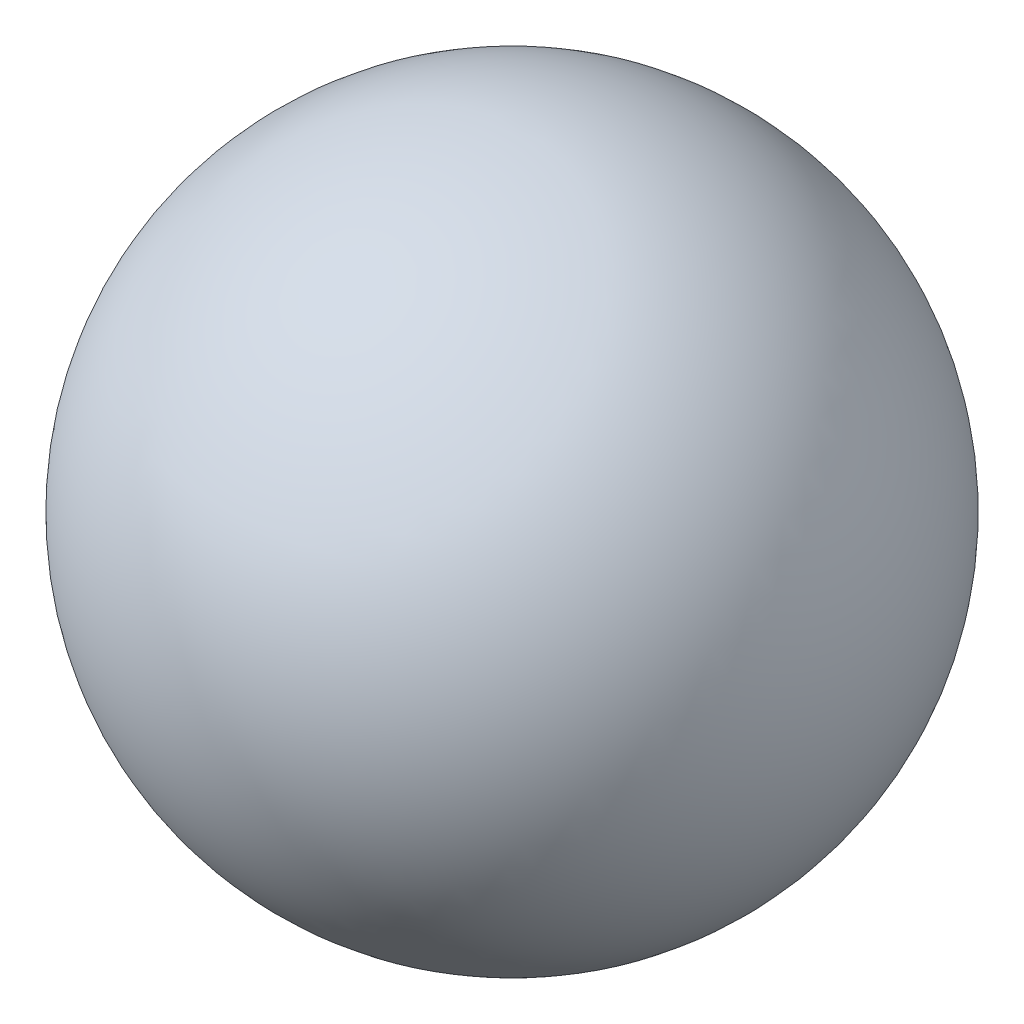
ISO-10303-21;
HEADER;
FILE_DESCRIPTION(('STEP AP214'),'2;1');
FILE_NAME('part.step','',(''),(''),'','','');
FILE_SCHEMA(('AUTOMOTIVE_DESIGN { 1 0 10303 214 1 1 1 1 }'));
ENDSEC;
DATA;
#1=APPLICATION_CONTEXT('core data for automotive mechanical design processes');
#2=APPLICATION_PROTOCOL_DEFINITION('international standard','automotive_design',2000,#1);
#3=PRODUCT_CONTEXT('',#1,'mechanical');
#4=PRODUCT('Part','Part','',(#3));
#5=PRODUCT_RELATED_PRODUCT_CATEGORY('part','',(#4));
#6=PRODUCT_DEFINITION_FORMATION('','',#4);
#7=PRODUCT_DEFINITION_CONTEXT('part definition',#1,'design');
#8=PRODUCT_DEFINITION('design','',#6,#7);
#9=PRODUCT_DEFINITION_SHAPE('','',#8);
#10=(LENGTH_UNIT() NAMED_UNIT(*) SI_UNIT(.MILLI.,.METRE.));
#11=(NAMED_UNIT(*) PLANE_ANGLE_UNIT() SI_UNIT($,.RADIAN.));
#12=(NAMED_UNIT(*) SI_UNIT($,.STERADIAN.) SOLID_ANGLE_UNIT());
#13=UNCERTAINTY_MEASURE_WITH_UNIT(LENGTH_MEASURE(1.E-05),#10,'distance_accuracy_value','');
#14=(GEOMETRIC_REPRESENTATION_CONTEXT(3) GLOBAL_UNCERTAINTY_ASSIGNED_CONTEXT((#13)) GLOBAL_UNIT_ASSIGNED_CONTEXT((#10,
#11,#12)) REPRESENTATION_CONTEXT('',''));
#15=CARTESIAN_POINT('',(0.,0.,0.));
#16=DIRECTION('',(0.,0.,1.));
#17=DIRECTION('',(1.,0.,0.));
#18=AXIS2_PLACEMENT_3D('',#15,#16,#17);
#19=CARTESIAN_POINT('',(0.,0.,0.));
#20=DIRECTION('',(0.,1.,0.));
#21=DIRECTION('',(1.,0.,0.));
#22=AXIS2_PLACEMENT_3D('',#19,#20,#21);
#23=SPHERICAL_SURFACE('',#22,21.);
#24=CARTESIAN_POINT('',(0.,21.,0.));
#25=VERTEX_POINT('',#24);
#26=VERTEX_LOOP('',#25);
#27=FACE_BOUND('',#26,.T.);
#28=ADVANCED_FACE('F28',(#27),#23,.T.);
#29=CLOSED_SHELL('',(#28));
#30=MANIFOLD_SOLID_BREP('B2',#29);
#31=ADVANCED_BREP_SHAPE_REPRESENTATION('',(#18,#30),#14);
#32=SHAPE_DEFINITION_REPRESENTATION(#9,#31);
ENDSEC;
END-ISO-10303-21;
